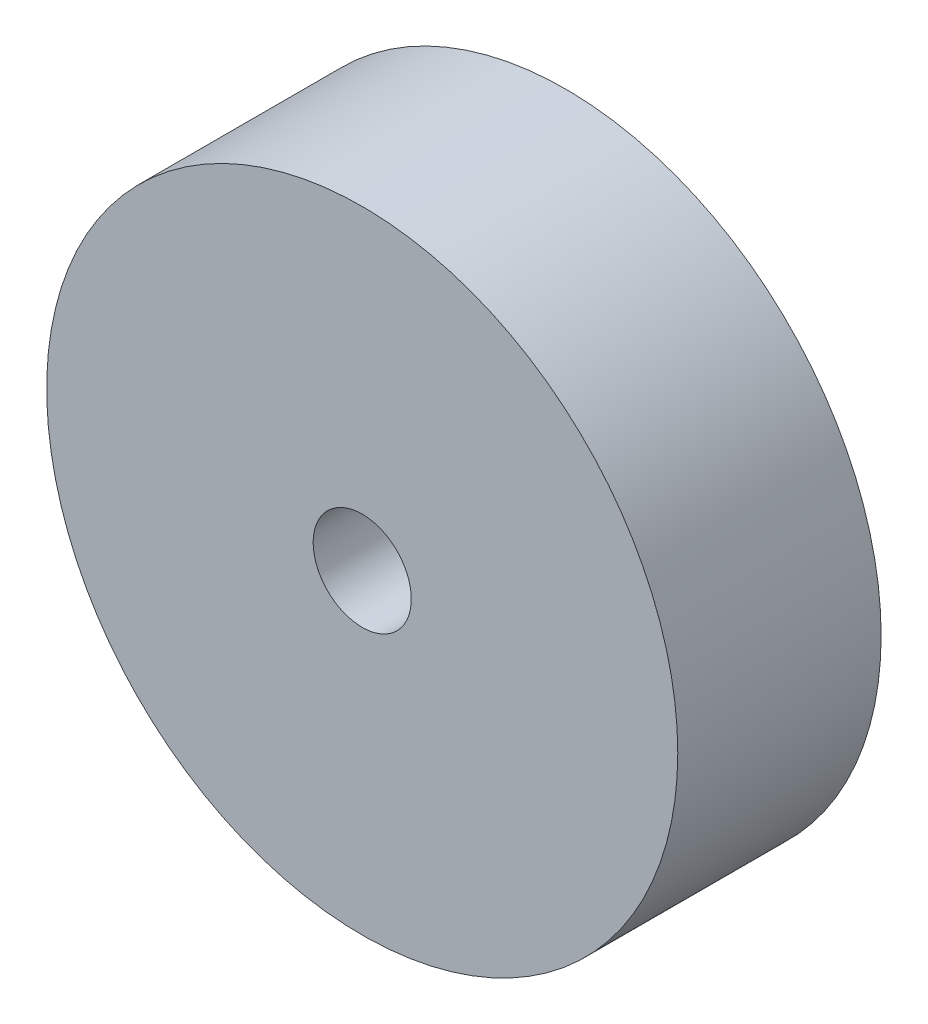
ISO-10303-21;
HEADER;
FILE_DESCRIPTION(('STEP AP214'),'2;1');
FILE_NAME('part.step','',(''),(''),'','','');
FILE_SCHEMA(('AUTOMOTIVE_DESIGN { 1 0 10303 214 1 1 1 1 }'));
ENDSEC;
DATA;
#1=APPLICATION_CONTEXT('core data for automotive mechanical design processes');
#2=APPLICATION_PROTOCOL_DEFINITION('international standard','automotive_design',2000,#1);
#3=PRODUCT_CONTEXT('',#1,'mechanical');
#4=PRODUCT('Part','Part','',(#3));
#5=PRODUCT_RELATED_PRODUCT_CATEGORY('part','',(#4));
#6=PRODUCT_DEFINITION_FORMATION('','',#4);
#7=PRODUCT_DEFINITION_CONTEXT('part definition',#1,'design');
#8=PRODUCT_DEFINITION('design','',#6,#7);
#9=PRODUCT_DEFINITION_SHAPE('','',#8);
#10=(LENGTH_UNIT() NAMED_UNIT(*) SI_UNIT(.MILLI.,.METRE.));
#11=(NAMED_UNIT(*) PLANE_ANGLE_UNIT() SI_UNIT($,.RADIAN.));
#12=(NAMED_UNIT(*) SI_UNIT($,.STERADIAN.) SOLID_ANGLE_UNIT());
#13=UNCERTAINTY_MEASURE_WITH_UNIT(LENGTH_MEASURE(1.E-05),#10,'distance_accuracy_value','');
#14=(GEOMETRIC_REPRESENTATION_CONTEXT(3) GLOBAL_UNCERTAINTY_ASSIGNED_CONTEXT((#13)) GLOBAL_UNIT_ASSIGNED_CONTEXT((#10,
#11,#12)) REPRESENTATION_CONTEXT('',''));
#15=CARTESIAN_POINT('',(0.,0.,0.));
#16=DIRECTION('',(0.,0.,1.));
#17=DIRECTION('',(1.,0.,0.));
#18=AXIS2_PLACEMENT_3D('',#15,#16,#17);
#19=CARTESIAN_POINT('',(-29.0822504710818,-1.70382614903984,5.8));
#20=DIRECTION('',(0.,0.,-1.));
#21=DIRECTION('',(-1.,0.,0.));
#22=AXIS2_PLACEMENT_3D('',#19,#20,#21);
#23=CYLINDRICAL_SURFACE('',#22,9.);
#24=CARTESIAN_POINT('',(-29.0822504710818,-1.70382614903984,5.8));
#25=DIRECTION('',(0.,0.,1.));
#26=DIRECTION('',(1.,0.,0.));
#27=AXIS2_PLACEMENT_3D('',#24,#25,#26);
#28=CIRCLE('',#27,9.);
#29=CARTESIAN_POINT('',(-20.0822504710818,-1.70382614903984,5.8));
#30=VERTEX_POINT('',#29);
#31=EDGE_CURVE('E46',#30,#30,#28,.T.);
#32=ORIENTED_EDGE('',*,*,#31,.F.);
#33=EDGE_LOOP('',(#32));
#34=FACE_BOUND('',#33,.T.);
#35=CARTESIAN_POINT('',(-29.0822504710818,-1.70382614903984,0.));
#36=DIRECTION('',(0.,0.,1.));
#37=DIRECTION('',(1.,0.,0.));
#38=AXIS2_PLACEMENT_3D('',#35,#36,#37);
#39=CIRCLE('',#38,9.);
#40=CARTESIAN_POINT('',(-20.0822504710818,-1.70382614903984,0.));
#41=VERTEX_POINT('',#40);
#42=EDGE_CURVE('E51',#41,#41,#39,.T.);
#43=ORIENTED_EDGE('',*,*,#42,.T.);
#44=EDGE_LOOP('',(#43));
#45=FACE_BOUND('',#44,.T.);
#46=ADVANCED_FACE('F39',(#34,#45),#23,.T.);
#47=CARTESIAN_POINT('',(-29.0822504710818,-1.70382614903984,5.8));
#48=DIRECTION('',(0.,0.,1.));
#49=DIRECTION('',(1.,0.,0.));
#50=AXIS2_PLACEMENT_3D('',#47,#48,#49);
#51=PLANE('',#50);
#52=CARTESIAN_POINT('',(-29.0822504710818,-1.70382614903984,5.8));
#53=DIRECTION('',(0.,0.,-1.));
#54=DIRECTION('',(-1.,0.,0.));
#55=AXIS2_PLACEMENT_3D('',#52,#53,#54);
#56=CIRCLE('',#55,1.4);
#57=CARTESIAN_POINT('',(-30.4822504710818,-1.70382614903984,5.8));
#58=VERTEX_POINT('',#57);
#59=EDGE_CURVE('E70',#58,#58,#56,.T.);
#60=ORIENTED_EDGE('',*,*,#59,.T.);
#61=EDGE_LOOP('',(#60));
#62=FACE_BOUND('',#61,.T.);
#63=ORIENTED_EDGE('',*,*,#31,.T.);
#64=EDGE_LOOP('',(#63));
#65=FACE_BOUND('',#64,.T.);
#66=ADVANCED_FACE('F79',(#62,#65),#51,.T.);
#67=CARTESIAN_POINT('',(-29.0822504710818,-1.70382614903984,0.));
#68=DIRECTION('',(0.,0.,1.));
#69=DIRECTION('',(1.,0.,0.));
#70=AXIS2_PLACEMENT_3D('',#67,#68,#69);
#71=PLANE('',#70);
#72=CARTESIAN_POINT('',(-29.0822504710818,-1.70382614903984,0.));
#73=DIRECTION('',(0.,0.,-1.));
#74=DIRECTION('',(-1.,0.,0.));
#75=AXIS2_PLACEMENT_3D('',#72,#73,#74);
#76=CIRCLE('',#75,6.4);
#77=CARTESIAN_POINT('',(-35.4822504710818,-1.70382614903984,0.));
#78=VERTEX_POINT('',#77);
#79=EDGE_CURVE('E59',#78,#78,#76,.T.);
#80=ORIENTED_EDGE('',*,*,#79,.F.);
#81=EDGE_LOOP('',(#80));
#82=FACE_BOUND('',#81,.T.);
#83=ORIENTED_EDGE('',*,*,#42,.F.);
#84=EDGE_LOOP('',(#83));
#85=FACE_BOUND('',#84,.T.);
#86=ADVANCED_FACE('F108',(#82,#85),#71,.F.);
#87=CARTESIAN_POINT('',(-29.0822504710818,-1.70382614903984,3.2));
#88=DIRECTION('',(0.,0.,-1.));
#89=DIRECTION('',(-1.,0.,0.));
#90=AXIS2_PLACEMENT_3D('',#87,#88,#89);
#91=CYLINDRICAL_SURFACE('',#90,6.4);
#92=CARTESIAN_POINT('',(-29.0822504710818,-1.70382614903984,3.2));
#93=DIRECTION('',(0.,0.,-1.));
#94=DIRECTION('',(-1.,0.,0.));
#95=AXIS2_PLACEMENT_3D('',#92,#93,#94);
#96=CIRCLE('',#95,6.4);
#97=CARTESIAN_POINT('',(-35.4822504710818,-1.70382614903984,3.2));
#98=VERTEX_POINT('',#97);
#99=EDGE_CURVE('E57',#98,#98,#96,.T.);
#100=ORIENTED_EDGE('',*,*,#99,.F.);
#101=EDGE_LOOP('',(#100));
#102=FACE_BOUND('',#101,.T.);
#103=ORIENTED_EDGE('',*,*,#79,.T.);
#104=EDGE_LOOP('',(#103));
#105=FACE_BOUND('',#104,.T.);
#106=ADVANCED_FACE('F100',(#102,#105),#91,.F.);
#107=CARTESIAN_POINT('',(-29.0822504710818,-1.70382614903984,3.2));
#108=DIRECTION('',(0.,0.,-1.));
#109=DIRECTION('',(-1.,0.,0.));
#110=AXIS2_PLACEMENT_3D('',#107,#108,#109);
#111=PLANE('',#110);
#112=CARTESIAN_POINT('',(-29.0822504710818,-1.70382614903984,3.2));
#113=DIRECTION('',(0.,0.,-1.));
#114=DIRECTION('',(-1.,0.,0.));
#115=AXIS2_PLACEMENT_3D('',#112,#113,#114);
#116=CIRCLE('',#115,3.15);
#117=CARTESIAN_POINT('',(-32.2322504710818,-1.70382614903984,3.2));
#118=VERTEX_POINT('',#117);
#119=EDGE_CURVE('E10',#118,#118,#116,.T.);
#120=ORIENTED_EDGE('',*,*,#119,.F.);
#121=EDGE_LOOP('',(#120));
#122=FACE_BOUND('',#121,.T.);
#123=ORIENTED_EDGE('',*,*,#99,.T.);
#124=EDGE_LOOP('',(#123));
#125=FACE_BOUND('',#124,.T.);
#126=ADVANCED_FACE('F95',(#122,#125),#111,.T.);
#127=CARTESIAN_POINT('',(-29.0822504710818,-1.70382614903984,3.2));
#128=DIRECTION('',(0.,0.,-1.));
#129=DIRECTION('',(-1.,0.,0.));
#130=AXIS2_PLACEMENT_3D('',#127,#128,#129);
#131=CYLINDRICAL_SURFACE('',#130,3.15);
#132=ORIENTED_EDGE('',*,*,#119,.T.);
#133=EDGE_LOOP('',(#132));
#134=FACE_BOUND('',#133,.T.);
#135=CARTESIAN_POINT('',(-29.0822504710818,-1.70382614903984,0.2));
#136=DIRECTION('',(0.,0.,-1.));
#137=DIRECTION('',(-1.,0.,0.));
#138=AXIS2_PLACEMENT_3D('',#135,#136,#137);
#139=CIRCLE('',#138,3.15);
#140=CARTESIAN_POINT('',(-32.2322504710818,-1.70382614903984,0.2));
#141=VERTEX_POINT('',#140);
#142=EDGE_CURVE('E63',#141,#141,#139,.T.);
#143=ORIENTED_EDGE('',*,*,#142,.F.);
#144=EDGE_LOOP('',(#143));
#145=FACE_BOUND('',#144,.T.);
#146=ADVANCED_FACE('F90',(#134,#145),#131,.T.);
#147=CARTESIAN_POINT('',(-29.0822504710818,-1.70382614903984,0.2));
#148=DIRECTION('',(0.,0.,-1.));
#149=DIRECTION('',(-1.,0.,0.));
#150=AXIS2_PLACEMENT_3D('',#147,#148,#149);
#151=PLANE('',#150);
#152=CARTESIAN_POINT('',(-29.0822504710818,-1.70382614903984,0.2));
#153=DIRECTION('',(0.,0.,-1.));
#154=DIRECTION('',(-1.,0.,0.));
#155=AXIS2_PLACEMENT_3D('',#152,#153,#154);
#156=CIRCLE('',#155,1.4);
#157=CARTESIAN_POINT('',(-30.4822504710818,-1.70382614903984,0.2));
#158=VERTEX_POINT('',#157);
#159=EDGE_CURVE('E71',#158,#158,#156,.T.);
#160=ORIENTED_EDGE('',*,*,#159,.F.);
#161=EDGE_LOOP('',(#160));
#162=FACE_BOUND('',#161,.T.);
#163=ORIENTED_EDGE('',*,*,#142,.T.);
#164=EDGE_LOOP('',(#163));
#165=FACE_BOUND('',#164,.T.);
#166=ADVANCED_FACE('F84',(#162,#165),#151,.T.);
#167=CARTESIAN_POINT('',(-29.0822504710818,-1.70382614903984,5.8));
#168=DIRECTION('',(0.,0.,-1.));
#169=DIRECTION('',(-1.,0.,0.));
#170=AXIS2_PLACEMENT_3D('',#167,#168,#169);
#171=CYLINDRICAL_SURFACE('',#170,1.4);
#172=ORIENTED_EDGE('',*,*,#59,.F.);
#173=EDGE_LOOP('',(#172));
#174=FACE_BOUND('',#173,.T.);
#175=ORIENTED_EDGE('',*,*,#159,.T.);
#176=EDGE_LOOP('',(#175));
#177=FACE_BOUND('',#176,.T.);
#178=ADVANCED_FACE('F81',(#174,#177),#171,.F.);
#179=CLOSED_SHELL('',(#46,#66,#86,#106,#126,#146,#166,#178));
#180=MANIFOLD_SOLID_BREP('B2',#179);
#181=ADVANCED_BREP_SHAPE_REPRESENTATION('',(#18,#180),#14);
#182=SHAPE_DEFINITION_REPRESENTATION(#9,#181);
ENDSEC;
END-ISO-10303-21;
